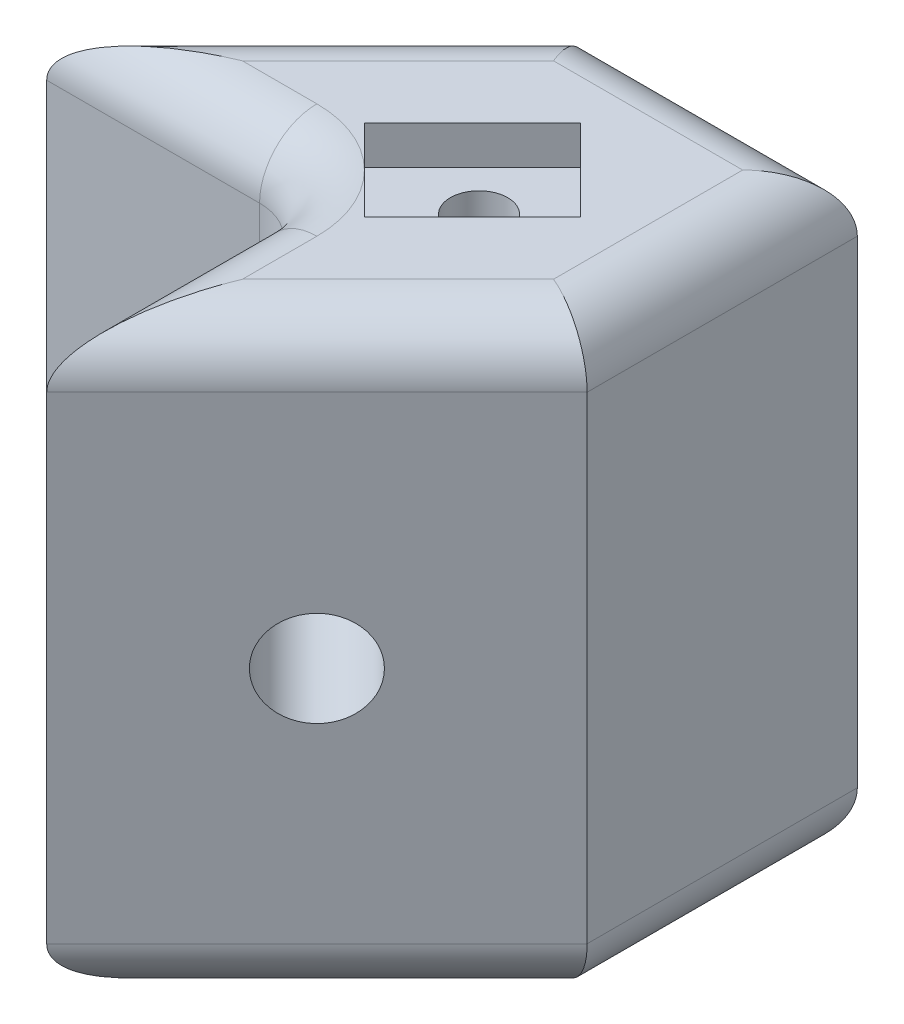
ISO-10303-21;
HEADER;
FILE_DESCRIPTION(('STEP AP214'),'2;1');
FILE_NAME('part.step','',(''),(''),'','','');
FILE_SCHEMA(('AUTOMOTIVE_DESIGN { 1 0 10303 214 1 1 1 1 }'));
ENDSEC;
DATA;
#1=APPLICATION_CONTEXT('core data for automotive mechanical design processes');
#2=APPLICATION_PROTOCOL_DEFINITION('international standard','automotive_design',2000,#1);
#3=PRODUCT_CONTEXT('',#1,'mechanical');
#4=PRODUCT('Part','Part','',(#3));
#5=PRODUCT_RELATED_PRODUCT_CATEGORY('part','',(#4));
#6=PRODUCT_DEFINITION_FORMATION('','',#4);
#7=PRODUCT_DEFINITION_CONTEXT('part definition',#1,'design');
#8=PRODUCT_DEFINITION('design','',#6,#7);
#9=PRODUCT_DEFINITION_SHAPE('','',#8);
#10=(LENGTH_UNIT() NAMED_UNIT(*) SI_UNIT(.MILLI.,.METRE.));
#11=(NAMED_UNIT(*) PLANE_ANGLE_UNIT() SI_UNIT($,.RADIAN.));
#12=(NAMED_UNIT(*) SI_UNIT($,.STERADIAN.) SOLID_ANGLE_UNIT());
#13=UNCERTAINTY_MEASURE_WITH_UNIT(LENGTH_MEASURE(1.E-05),#10,'distance_accuracy_value','');
#14=(GEOMETRIC_REPRESENTATION_CONTEXT(3) GLOBAL_UNCERTAINTY_ASSIGNED_CONTEXT((#13)) GLOBAL_UNIT_ASSIGNED_CONTEXT((#10,
#11,#12)) REPRESENTATION_CONTEXT('',''));
#15=CARTESIAN_POINT('',(0.,0.,0.));
#16=DIRECTION('',(0.,0.,1.));
#17=DIRECTION('',(1.,0.,0.));
#18=AXIS2_PLACEMENT_3D('',#15,#16,#17);
#19=CARTESIAN_POINT('',(0.,0.,0.));
#20=DIRECTION('',(0.,-1.,0.));
#21=DIRECTION('',(0.,0.,-1.));
#22=AXIS2_PLACEMENT_3D('',#19,#20,#21);
#23=PLANE('',#22);
#24=DIRECTION('',(-0.707106781186547,0.,-0.707106781186548));
#25=VECTOR('',#24,1.);
#26=CARTESIAN_POINT('',(-68.4414086658803,0.,95.3821770290879));
#27=LINE('',#26,#25);
#28=CARTESIAN_POINT('',(-68.4414086658803,0.,95.3821770290879));
#29=VERTEX_POINT('',#28);
#30=CARTESIAN_POINT('',(-81.911792847484,0.,81.9117928474841));
#31=VERTEX_POINT('',#30);
#32=EDGE_CURVE('E195',#29,#31,#27,.T.);
#33=ORIENTED_EDGE('',*,*,#32,.T.);
#34=CARTESIAN_POINT('',(-108.852561210692,0.,108.852561210692));
#35=DIRECTION('',(0.,-1.,0.));
#36=DIRECTION('',(0.,0.,-1.));
#37=AXIS2_PLACEMENT_3D('',#34,#35,#36);
#38=CIRCLE('',#37,38.1);
#39=CARTESIAN_POINT('',(-70.7525612106915,0.,108.852561210692));
#40=VERTEX_POINT('',#39);
#41=EDGE_CURVE('E281',#40,#31,#38,.F.);
#42=ORIENTED_EDGE('',*,*,#41,.F.);
#43=DIRECTION('',(0.,0.,1.));
#44=VECTOR('',#43,1.);
#45=CARTESIAN_POINT('',(-70.7525612106915,0.,179.605122524692));
#46=LINE('',#45,#44);
#47=CARTESIAN_POINT('',(-70.7525612106915,0.,133.614354161484));
#48=VERTEX_POINT('',#47);
#49=EDGE_CURVE('E287',#40,#48,#46,.T.);
#50=ORIENTED_EDGE('',*,*,#49,.T.);
#51=DIRECTION('',(-0.707106781186548,0.,0.707106781186548));
#52=VECTOR('',#51,1.);
#53=CARTESIAN_POINT('',(31.4308964753963,0.,31.4308964753963));
#54=LINE('',#53,#52);
#55=CARTESIAN_POINT('',(-19.05,0.,81.9117929507925));
#56=VERTEX_POINT('',#55);
#57=EDGE_CURVE('E289',#48,#56,#54,.F.);
#58=ORIENTED_EDGE('',*,*,#57,.T.);
#59=DIRECTION('',(0.,0.,1.));
#60=VECTOR('',#59,1.);
#61=CARTESIAN_POINT('',(-19.05,0.,0.));
#62=LINE('',#61,#60);
#63=CARTESIAN_POINT('',(-19.05,0.,19.05));
#64=VERTEX_POINT('',#63);
#65=EDGE_CURVE('E291',#56,#64,#62,.F.);
#66=ORIENTED_EDGE('',*,*,#65,.T.);
#67=DIRECTION('',(-1.,0.,0.));
#68=VECTOR('',#67,1.);
#69=CARTESIAN_POINT('',(-89.802561314,0.,19.05));
#70=LINE('',#69,#68);
#71=CARTESIAN_POINT('',(-81.9117929507925,0.,19.05));
#72=VERTEX_POINT('',#71);
#73=EDGE_CURVE('E293',#64,#72,#70,.T.);
#74=ORIENTED_EDGE('',*,*,#73,.T.);
#75=DIRECTION('',(-0.707106781186547,0.,0.707106781186548));
#76=VECTOR('',#75,1.);
#77=CARTESIAN_POINT('',(-166.134738343088,0.,103.272945392295));
#78=LINE('',#77,#76);
#79=CARTESIAN_POINT('',(-133.614354161484,0.,70.7525612106916));
#80=VERTEX_POINT('',#79);
#81=EDGE_CURVE('E295',#72,#80,#78,.T.);
#82=ORIENTED_EDGE('',*,*,#81,.T.);
#83=DIRECTION('',(1.,0.,0.));
#84=VECTOR('',#83,1.);
#85=CARTESIAN_POINT('',(-89.8025612106915,0.,70.7525612106916));
#86=LINE('',#85,#84);
#87=CARTESIAN_POINT('',(-108.852561210692,0.,70.7525612106916));
#88=VERTEX_POINT('',#87);
#89=EDGE_CURVE('E284',#80,#88,#86,.T.);
#90=ORIENTED_EDGE('',*,*,#89,.T.);
#91=EDGE_CURVE('E280',#31,#88,#38,.F.);
#92=ORIENTED_EDGE('',*,*,#91,.F.);
#93=CARTESIAN_POINT('',(-95.3821770290878,0.,68.4414086658804));
#94=VERTEX_POINT('',#93);
#95=EDGE_CURVE('E471',#31,#94,#27,.T.);
#96=ORIENTED_EDGE('',*,*,#95,.T.);
#97=DIRECTION('',(-0.707106781186548,0.,0.707106781186548));
#98=VECTOR('',#97,1.);
#99=CARTESIAN_POINT('',(-59.4611525448112,0.,32.5203841816038));
#100=LINE('',#99,#98);
#101=CARTESIAN_POINT('',(-59.4611525448112,0.,32.5203841816038));
#102=VERTEX_POINT('',#101);
#103=EDGE_CURVE('E470',#102,#94,#100,.T.);
#104=ORIENTED_EDGE('',*,*,#103,.F.);
#105=DIRECTION('',(-0.707106781186548,0.,-0.707106781186547));
#106=VECTOR('',#105,1.);
#107=CARTESIAN_POINT('',(-32.5203841816037,0.,59.4611525448112));
#108=LINE('',#107,#106);
#109=CARTESIAN_POINT('',(-32.5203841816037,0.,59.4611525448112));
#110=VERTEX_POINT('',#109);
#111=EDGE_CURVE('E191',#110,#102,#108,.T.);
#112=ORIENTED_EDGE('',*,*,#111,.F.);
#113=DIRECTION('',(-0.707106781186547,0.,0.707106781186548));
#114=VECTOR('',#113,1.);
#115=CARTESIAN_POINT('',(-32.5203841816037,0.,59.4611525448112));
#116=LINE('',#115,#114);
#117=EDGE_CURVE('E49',#110,#29,#116,.T.);
#118=ORIENTED_EDGE('',*,*,#117,.T.);
#119=EDGE_LOOP('',(#33,#42,#50,#58,#66,#74,#82,#90,#92,#96,#104,#112,#118));
#120=FACE_BOUND('',#119,.T.);
#121=ADVANCED_FACE('F33',(#120),#23,.F.);
#122=CARTESIAN_POINT('',(-108.852561210692,-196.85,108.852561210692));
#123=DIRECTION('',(0.,-1.,0.));
#124=DIRECTION('',(0.,0.,-1.));
#125=AXIS2_PLACEMENT_3D('',#122,#123,#124);
#126=CYLINDRICAL_SURFACE('',#125,19.05);
#127=DIRECTION('',(0.,1.,0.));
#128=VECTOR('',#127,1.);
#129=CARTESIAN_POINT('',(-89.8025612106915,-196.85,108.852561210692));
#130=LINE('',#129,#128);
#131=CARTESIAN_POINT('',(-89.8025612106915,-106.952260529771,108.852561210692));
#132=VERTEX_POINT('',#131);
#133=CARTESIAN_POINT('',(-89.8025612106915,-177.8,108.852561210692));
#134=VERTEX_POINT('',#133);
#135=EDGE_CURVE('E242',#132,#134,#130,.F.);
#136=ORIENTED_EDGE('',*,*,#135,.F.);
#137=CARTESIAN_POINT('',(-89.8025612106915,-106.952260529771,108.852561210692));
#138=CARTESIAN_POINT('',(-89.8025610996064,-107.091775465421,108.729526025421));
#139=CARTESIAN_POINT('',(-89.8037536623177,-107.22856093161,108.603436358006));
#140=CARTESIAN_POINT('',(-89.8088739008022,-107.496518397596,108.34548802045));
#141=CARTESIAN_POINT('',(-89.8128014932628,-107.627690568253,108.213629526152));
#142=CARTESIAN_POINT('',(-89.8292030698284,-108.012369571792,107.810107184494));
#143=CARTESIAN_POINT('',(-89.846294775377,-108.257254987542,107.530305270507));
#144=CARTESIAN_POINT('',(-89.8951696255817,-108.721421500706,106.954464212028));
#145=CARTESIAN_POINT('',(-89.92685818176,-108.940856229056,106.658540264672));
#146=CARTESIAN_POINT('',(-90.0069944433419,-109.3557306283,106.052467823452));
#147=CARTESIAN_POINT('',(-90.0554429804663,-109.551169107718,105.742318624317));
#148=CARTESIAN_POINT('',(-90.1706722920117,-109.91818845735,105.111962736147));
#149=CARTESIAN_POINT('',(-90.2374340989217,-110.089793736707,104.791766755041));
#150=CARTESIAN_POINT('',(-90.3904523707396,-110.410258574604,104.144742652783));
#151=CARTESIAN_POINT('',(-90.4767092036677,-110.559117703661,103.817914406535));
#152=CARTESIAN_POINT('',(-90.6694881334242,-110.835464906661,103.160838787148));
#153=CARTESIAN_POINT('',(-90.7760300304495,-110.962931869126,102.83058837396));
#154=CARTESIAN_POINT('',(-91.0095952709221,-111.197794829894,102.170214835167));
#155=CARTESIAN_POINT('',(-91.1366191787674,-111.305190274934,101.840091713321));
#156=CARTESIAN_POINT('',(-91.41774615504,-111.506232630746,101.166916072162));
#157=CARTESIAN_POINT('',(-91.5728638745224,-111.598959946759,100.82401314344));
#158=CARTESIAN_POINT('',(-91.9051606068343,-111.765819410796,100.144449915766));
#159=CARTESIAN_POINT('',(-92.0823401511815,-111.839951110682,99.807789767441));
#160=CARTESIAN_POINT('',(-92.4581982842507,-111.97123906271,99.1431232847985));
#161=CARTESIAN_POINT('',(-92.6568847626098,-112.028389056269,98.8151201815023));
#162=CARTESIAN_POINT('',(-93.0748873289587,-112.127028880149,98.1700874550337));
#163=CARTESIAN_POINT('',(-93.2942046522671,-112.16851777198,97.8530584905197));
#164=CARTESIAN_POINT('',(-93.7826422308346,-112.241381576293,97.1910555457931));
#165=CARTESIAN_POINT('',(-94.0545195466216,-112.270710307109,96.8478856639461));
#166=CARTESIAN_POINT('',(-94.6218567282006,-112.31166501369,96.1804886498483));
#167=CARTESIAN_POINT('',(-94.9173184580532,-112.323289588697,95.8562630184246));
#168=CARTESIAN_POINT('',(-95.5301729926641,-112.329238948039,95.228725032346));
#169=CARTESIAN_POINT('',(-95.8475776807528,-112.32355428559,94.9254241900891));
#170=CARTESIAN_POINT('',(-96.502126684382,-112.294664995062,94.3418225160919));
#171=CARTESIAN_POINT('',(-96.8392712942535,-112.271460105689,94.0615220274467));
#172=CARTESIAN_POINT('',(-97.5504349156602,-112.204913802739,93.5105294226009));
#173=CARTESIAN_POINT('',(-97.9254614302025,-112.160514225992,93.2412620973615));
#174=CARTESIAN_POINT('',(-98.6918141688159,-112.049649373284,92.7319723184823));
#175=CARTESIAN_POINT('',(-99.0831413983237,-111.983182734446,92.4919516723883));
#176=CARTESIAN_POINT('',(-99.8782884427921,-111.825928877781,92.0426418343549));
#177=CARTESIAN_POINT('',(-100.282105839222,-111.735146342602,91.8333467374265));
#178=CARTESIAN_POINT('',(-101.097875043374,-111.526489792149,91.446497852784));
#179=CARTESIAN_POINT('',(-101.509826049897,-111.408618433206,91.2689409558536));
#180=CARTESIAN_POINT('',(-102.318045077542,-111.148719195231,90.9533363911722));
#181=CARTESIAN_POINT('',(-102.714184213489,-111.008017729368,90.8138699005165));
#182=CARTESIAN_POINT('',(-103.503910152308,-110.696462748399,90.5641526305048));
#183=CARTESIAN_POINT('',(-103.897496807734,-110.525607507259,90.4539035244881));
#184=CARTESIAN_POINT('',(-104.675289772638,-110.151881346529,90.2618901292665));
#185=CARTESIAN_POINT('',(-105.059514239157,-109.949079236432,90.1800658036844));
#186=CARTESIAN_POINT('',(-105.812954655852,-109.509680368496,90.0427295033597));
#187=CARTESIAN_POINT('',(-106.182177825086,-109.273100119154,89.9872047320519));
#188=CARTESIAN_POINT('',(-106.751137912888,-108.870477432954,89.9176288139922));
#189=CARTESIAN_POINT('',(-106.957948362577,-108.715606593162,89.8959181308676));
#190=CARTESIAN_POINT('',(-107.362895319683,-108.394197288004,89.8598082815274));
#191=CARTESIAN_POINT('',(-107.561034467749,-108.227662415396,89.8454068750791));
#192=CARTESIAN_POINT('',(-107.947864851645,-107.882792621584,89.8230673732051));
#193=CARTESIAN_POINT('',(-108.136536153398,-107.70443449951,89.8151424183965));
#194=CARTESIAN_POINT('',(-108.503000577495,-107.336580562159,89.8048841352306));
#195=CARTESIAN_POINT('',(-108.680789328886,-107.147080330816,89.8025530394589));
#196=CARTESIAN_POINT('',(-108.852561210691,-106.952260529771,89.8025612106916));
#197=B_SPLINE_CURVE_WITH_KNOTS('',3,(#137,#138,#139,#140,#141,#142,#143,#144,#145,#146,#147,
#148,#149,#150,#151,#152,#153,#154,#155,#156,#157,#158,#159,#160,#161,#162,#163,#164,#165,#166,
#167,#168,#169,#170,#171,#172,#173,#174,#175,#176,#177,#178,#179,#180,#181,#182,#183,#184,#185,
#186,#187,#188,#189,#190,#191,#192,#193,#194,#195,#196),.UNSPECIFIED.,.F.,.F.,(4,2,2,2,2,2,2,2,
2,2,2,2,2,2,2,2,2,2,2,2,2,2,2,2,2,2,2,2,2,4),(0.,0.557947202142601,1.11587740919651,
2.23087546362454,3.33874776128075,4.44667504543604,5.55345912635883,6.66026410249992,
7.76815501862607,8.87607646878619,10.0377398989257,11.199431321503,12.3615503543313,
13.5237390160175,14.838686776963,16.1537385716191,17.469508204742,18.7852974615709,
20.1750176924842,21.5648237693857,22.9543623957755,24.3437648220382,25.6706169537621,
26.9975450606032,28.3216532564673,29.6451165179323,30.4225149082763,31.1996748883567,
31.9784078258347,32.7574515146123),.UNSPECIFIED.);
#198=CARTESIAN_POINT('',(-108.852561210692,-106.952260529771,89.8025612106916));
#199=VERTEX_POINT('',#198);
#200=EDGE_CURVE('E11',#132,#199,#197,.T.);
#201=ORIENTED_EDGE('',*,*,#200,.T.);
#202=DIRECTION('',(0.,1.,0.));
#203=VECTOR('',#202,1.);
#204=CARTESIAN_POINT('',(-108.852561210692,0.,89.8025612106916));
#205=LINE('',#204,#203);
#206=CARTESIAN_POINT('',(-108.852561210692,-177.8,89.8025612106916));
#207=VERTEX_POINT('',#206);
#208=EDGE_CURVE('E235',#207,#199,#205,.T.);
#209=ORIENTED_EDGE('',*,*,#208,.F.);
#210=CARTESIAN_POINT('',(-108.852561210692,-177.8,108.852561210692));
#211=DIRECTION('',(0.,-1.,0.));
#212=DIRECTION('',(0.,0.,-1.));
#213=AXIS2_PLACEMENT_3D('',#210,#211,#212);
#214=CIRCLE('',#213,19.05);
#215=EDGE_CURVE('E300',#207,#134,#214,.T.);
#216=ORIENTED_EDGE('',*,*,#215,.T.);
#217=EDGE_LOOP('',(#136,#201,#209,#216));
#218=FACE_BOUND('',#217,.T.);
#219=ADVANCED_FACE('F371',(#218),#126,.F.);
#220=CARTESIAN_POINT('',(-179.605122524692,-196.85,89.8025612106916));
#221=DIRECTION('',(0.,0.,1.));
#222=DIRECTION('',(1.,0.,0.));
#223=AXIS2_PLACEMENT_3D('',#220,#221,#222);
#224=PLANE('',#223);
#225=CARTESIAN_POINT('',(-89.8025613139999,-98.552,89.8025612106916));
#226=DIRECTION('',(0.,0.,1.));
#227=DIRECTION('',(1.,0.,0.));
#228=AXIS2_PLACEMENT_3D('',#225,#226,#227);
#229=ELLIPSE('',#228,22.4506403026729,15.875);
#230=CARTESIAN_POINT('',(-108.852561210692,-90.1517394702293,89.8025612106916));
#231=VERTEX_POINT('',#230);
#232=EDGE_CURVE('E210',#231,#199,#229,.T.);
#233=ORIENTED_EDGE('',*,*,#232,.F.);
#234=CARTESIAN_POINT('',(-108.852561210692,-19.05,89.8025612106916));
#235=VERTEX_POINT('',#234);
#236=EDGE_CURVE('E234',#231,#235,#205,.T.);
#237=ORIENTED_EDGE('',*,*,#236,.T.);
#238=DIRECTION('',(1.,0.,0.));
#239=VECTOR('',#238,1.);
#240=CARTESIAN_POINT('',(-179.605122524692,-19.05,89.8025612106916));
#241=LINE('',#240,#239);
#242=CARTESIAN_POINT('',(-179.605122524692,-19.05,89.8025612106916));
#243=VERTEX_POINT('',#242);
#244=EDGE_CURVE('E219',#235,#243,#241,.F.);
#245=ORIENTED_EDGE('',*,*,#244,.T.);
#246=DIRECTION('',(0.,1.,0.));
#247=VECTOR('',#246,1.);
#248=CARTESIAN_POINT('',(-179.605122524692,-196.85,89.8025612106916));
#249=LINE('',#248,#247);
#250=CARTESIAN_POINT('',(-179.605122524692,-177.8,89.8025612106916));
#251=VERTEX_POINT('',#250);
#252=EDGE_CURVE('E216',#251,#243,#249,.T.);
#253=ORIENTED_EDGE('',*,*,#252,.F.);
#254=DIRECTION('',(1.,0.,0.));
#255=VECTOR('',#254,1.);
#256=CARTESIAN_POINT('',(-179.605122524692,-177.8,89.8025612106916));
#257=LINE('',#256,#255);
#258=EDGE_CURVE('E238',#251,#207,#257,.T.);
#259=ORIENTED_EDGE('',*,*,#258,.T.);
#260=ORIENTED_EDGE('',*,*,#208,.T.);
#261=EDGE_LOOP('',(#233,#237,#245,#253,#259,#260));
#262=FACE_BOUND('',#261,.T.);
#263=ADVANCED_FACE('F377',(#262),#224,.T.);
#264=CARTESIAN_POINT('',(-89.802561314,-196.85,0.));
#265=DIRECTION('',(-0.707106781186548,0.,-0.707106781186547));
#266=DIRECTION('',(-0.707106781186547,0.,0.707106781186548));
#267=AXIS2_PLACEMENT_3D('',#264,#265,#266);
#268=PLANE('',#267);
#269=CARTESIAN_POINT('',(-134.703841919346,-98.552,44.9012806053457));
#270=DIRECTION('',(-0.707106781186548,0.,-0.707106781186547));
#271=DIRECTION('',(-0.707106781186547,0.,0.707106781186548));
#272=AXIS2_PLACEMENT_3D('',#269,#270,#271);
#273=CIRCLE('',#272,15.875);
#274=CARTESIAN_POINT('',(-145.929162070682,-98.552,56.1266007566822));
#275=VERTEX_POINT('',#274);
#276=EDGE_CURVE('E212',#275,#275,#273,.T.);
#277=ORIENTED_EDGE('',*,*,#276,.F.);
#278=EDGE_LOOP('',(#277));
#279=FACE_BOUND('',#278,.T.);
#280=DIRECTION('',(0.,1.,0.));
#281=VECTOR('',#280,1.);
#282=CARTESIAN_POINT('',(-89.802561314,-196.85,0.));
#283=LINE('',#282,#281);
#284=CARTESIAN_POINT('',(-89.802561314,-177.8,0.));
#285=VERTEX_POINT('',#284);
#286=CARTESIAN_POINT('',(-89.802561314,-19.05,0.));
#287=VERTEX_POINT('',#286);
#288=EDGE_CURVE('E220',#285,#287,#283,.T.);
#289=ORIENTED_EDGE('',*,*,#288,.F.);
#290=DIRECTION('',(-0.707106781186547,0.,0.707106781186548));
#291=VECTOR('',#290,1.);
#292=CARTESIAN_POINT('',(-89.802561314,-177.8,0.));
#293=LINE('',#292,#291);
#294=EDGE_CURVE('E250',#285,#251,#293,.T.);
#295=ORIENTED_EDGE('',*,*,#294,.T.);
#296=ORIENTED_EDGE('',*,*,#252,.T.);
#297=DIRECTION('',(-0.707106781186547,0.,0.707106781186548));
#298=VECTOR('',#297,1.);
#299=CARTESIAN_POINT('',(-89.802561314,-19.05,0.));
#300=LINE('',#299,#298);
#301=EDGE_CURVE('E248',#243,#287,#300,.F.);
#302=ORIENTED_EDGE('',*,*,#301,.T.);
#303=EDGE_LOOP('',(#289,#295,#296,#302));
#304=FACE_BOUND('',#303,.T.);
#305=ADVANCED_FACE('F373',(#279,#304),#268,.T.);
#306=CARTESIAN_POINT('',(0.,-196.85,0.));
#307=DIRECTION('',(0.,0.,-1.));
#308=DIRECTION('',(-1.,0.,0.));
#309=AXIS2_PLACEMENT_3D('',#306,#307,#308);
#310=PLANE('',#309);
#311=DIRECTION('',(0.,1.,0.));
#312=VECTOR('',#311,1.);
#313=CARTESIAN_POINT('',(0.,-196.85,0.));
#314=LINE('',#313,#312);
#315=CARTESIAN_POINT('',(0.,-177.8,0.));
#316=VERTEX_POINT('',#315);
#317=CARTESIAN_POINT('',(0.,-19.05,0.));
#318=VERTEX_POINT('',#317);
#319=EDGE_CURVE('E223',#316,#318,#314,.T.);
#320=ORIENTED_EDGE('',*,*,#319,.F.);
#321=DIRECTION('',(-1.,0.,0.));
#322=VECTOR('',#321,1.);
#323=CARTESIAN_POINT('',(0.,-177.8,0.));
#324=LINE('',#323,#322);
#325=EDGE_CURVE('E278',#316,#285,#324,.T.);
#326=ORIENTED_EDGE('',*,*,#325,.T.);
#327=ORIENTED_EDGE('',*,*,#288,.T.);
#328=DIRECTION('',(-1.,0.,0.));
#329=VECTOR('',#328,1.);
#330=CARTESIAN_POINT('',(0.,-19.05,0.));
#331=LINE('',#330,#329);
#332=EDGE_CURVE('E276',#287,#318,#331,.F.);
#333=ORIENTED_EDGE('',*,*,#332,.T.);
#334=EDGE_LOOP('',(#320,#326,#327,#333));
#335=FACE_BOUND('',#334,.T.);
#336=ADVANCED_FACE('F376',(#335),#310,.T.);
#337=CARTESIAN_POINT('',(0.,-196.85,0.));
#338=DIRECTION('',(-1.,0.,0.));
#339=DIRECTION('',(0.,0.,1.));
#340=AXIS2_PLACEMENT_3D('',#337,#338,#339);
#341=PLANE('',#340);
#342=DIRECTION('',(0.,1.,0.));
#343=VECTOR('',#342,1.);
#344=CARTESIAN_POINT('',(0.,-196.85,89.802561314));
#345=LINE('',#344,#343);
#346=CARTESIAN_POINT('',(0.,-177.8,89.802561314));
#347=VERTEX_POINT('',#346);
#348=CARTESIAN_POINT('',(0.,-19.05,89.802561314));
#349=VERTEX_POINT('',#348);
#350=EDGE_CURVE('E226',#347,#349,#345,.T.);
#351=ORIENTED_EDGE('',*,*,#350,.F.);
#352=DIRECTION('',(0.,0.,1.));
#353=VECTOR('',#352,1.);
#354=CARTESIAN_POINT('',(0.,-177.8,0.));
#355=LINE('',#354,#353);
#356=EDGE_CURVE('E274',#347,#316,#355,.F.);
#357=ORIENTED_EDGE('',*,*,#356,.T.);
#358=ORIENTED_EDGE('',*,*,#319,.T.);
#359=DIRECTION('',(0.,0.,1.));
#360=VECTOR('',#359,1.);
#361=CARTESIAN_POINT('',(0.,-19.05,0.));
#362=LINE('',#361,#360);
#363=EDGE_CURVE('E272',#318,#349,#362,.T.);
#364=ORIENTED_EDGE('',*,*,#363,.T.);
#365=EDGE_LOOP('',(#351,#357,#358,#364));
#366=FACE_BOUND('',#365,.T.);
#367=ADVANCED_FACE('F381',(#366),#341,.F.);
#368=CARTESIAN_POINT('',(0.,-196.85,89.802561314));
#369=DIRECTION('',(-0.707106781186548,0.,-0.707106781186548));
#370=DIRECTION('',(-0.707106781186548,0.,0.707106781186548));
#371=AXIS2_PLACEMENT_3D('',#368,#369,#370);
#372=PLANE('',#371);
#373=CARTESIAN_POINT('',(-44.9012806053457,-98.552,134.703841919346));
#374=DIRECTION('',(0.707106781186548,0.,0.707106781186547));
#375=DIRECTION('',(0.707106781186547,0.,-0.707106781186548));
#376=AXIS2_PLACEMENT_3D('',#373,#374,#375);
#377=CIRCLE('',#376,15.875);
#378=CARTESIAN_POINT('',(-33.6759604540092,-98.552,123.478521768009));
#379=VERTEX_POINT('',#378);
#380=EDGE_CURVE('E206',#379,#379,#377,.T.);
#381=ORIENTED_EDGE('',*,*,#380,.F.);
#382=EDGE_LOOP('',(#381));
#383=FACE_BOUND('',#382,.T.);
#384=DIRECTION('',(0.,1.,0.));
#385=VECTOR('',#384,1.);
#386=CARTESIAN_POINT('',(-89.8025612106915,-196.85,179.605122524692));
#387=LINE('',#386,#385);
#388=CARTESIAN_POINT('',(-89.8025612106915,-177.8,179.605122524692));
#389=VERTEX_POINT('',#388);
#390=CARTESIAN_POINT('',(-89.8025612106915,-19.05,179.605122524692));
#391=VERTEX_POINT('',#390);
#392=EDGE_CURVE('E229',#389,#391,#387,.T.);
#393=ORIENTED_EDGE('',*,*,#392,.F.);
#394=DIRECTION('',(-0.707106781186548,0.,0.707106781186548));
#395=VECTOR('',#394,1.);
#396=CARTESIAN_POINT('',(0.,-177.8,89.802561314));
#397=LINE('',#396,#395);
#398=EDGE_CURVE('E270',#389,#347,#397,.F.);
#399=ORIENTED_EDGE('',*,*,#398,.T.);
#400=ORIENTED_EDGE('',*,*,#350,.T.);
#401=DIRECTION('',(-0.707106781186548,0.,0.707106781186548));
#402=VECTOR('',#401,1.);
#403=CARTESIAN_POINT('',(0.,-19.05,89.802561314));
#404=LINE('',#403,#402);
#405=EDGE_CURVE('E268',#349,#391,#404,.T.);
#406=ORIENTED_EDGE('',*,*,#405,.T.);
#407=EDGE_LOOP('',(#393,#399,#400,#406));
#408=FACE_BOUND('',#407,.T.);
#409=ADVANCED_FACE('F385',(#383,#408),#372,.F.);
#410=CARTESIAN_POINT('',(-89.8025612106915,-196.85,89.8025612106916));
#411=DIRECTION('',(-1.,0.,0.));
#412=DIRECTION('',(0.,0.,1.));
#413=AXIS2_PLACEMENT_3D('',#410,#411,#412);
#414=PLANE('',#413);
#415=CARTESIAN_POINT('',(-89.8025612106915,-98.552,89.8025613139999));
#416=DIRECTION('',(-1.,0.,0.));
#417=DIRECTION('',(0.,0.,1.));
#418=AXIS2_PLACEMENT_3D('',#415,#416,#417);
#419=ELLIPSE('',#418,22.4506403026729,15.875);
#420=CARTESIAN_POINT('',(-89.8025612106915,-90.1517394702293,108.852561210692));
#421=VERTEX_POINT('',#420);
#422=EDGE_CURVE('E57',#132,#421,#419,.T.);
#423=ORIENTED_EDGE('',*,*,#422,.F.);
#424=ORIENTED_EDGE('',*,*,#135,.T.);
#425=DIRECTION('',(0.,0.,1.));
#426=VECTOR('',#425,1.);
#427=CARTESIAN_POINT('',(-89.8025612106915,-177.8,89.8025612106916));
#428=LINE('',#427,#426);
#429=EDGE_CURVE('E246',#134,#389,#428,.T.);
#430=ORIENTED_EDGE('',*,*,#429,.T.);
#431=ORIENTED_EDGE('',*,*,#392,.T.);
#432=DIRECTION('',(0.,0.,1.));
#433=VECTOR('',#432,1.);
#434=CARTESIAN_POINT('',(-89.8025612106915,-19.05,89.8025612106916));
#435=LINE('',#434,#433);
#436=CARTESIAN_POINT('',(-89.8025612106915,-19.05,108.852561210692));
#437=VERTEX_POINT('',#436);
#438=EDGE_CURVE('E240',#391,#437,#435,.F.);
#439=ORIENTED_EDGE('',*,*,#438,.T.);
#440=EDGE_CURVE('E243',#437,#421,#130,.F.);
#441=ORIENTED_EDGE('',*,*,#440,.T.);
#442=EDGE_LOOP('',(#423,#424,#430,#431,#439,#441));
#443=FACE_BOUND('',#442,.T.);
#444=ADVANCED_FACE('F367',(#443),#414,.T.);
#445=CARTESIAN_POINT('',(0.,-196.85,0.));
#446=DIRECTION('',(0.,-1.,0.));
#447=DIRECTION('',(0.,0.,-1.));
#448=AXIS2_PLACEMENT_3D('',#445,#446,#447);
#449=PLANE('',#448);
#450=CARTESIAN_POINT('',(-62.8617928474841,-196.85,62.8617928474841));
#451=DIRECTION('',(0.,1.,0.));
#452=DIRECTION('',(0.,0.,1.));
#453=AXIS2_PLACEMENT_3D('',#450,#451,#452);
#454=CIRCLE('',#453,9.525);
#455=CARTESIAN_POINT('',(-62.8617928474841,-196.85,72.3867928474841));
#456=VERTEX_POINT('',#455);
#457=EDGE_CURVE('E199',#456,#456,#454,.T.);
#458=ORIENTED_EDGE('',*,*,#457,.T.);
#459=EDGE_LOOP('',(#458));
#460=FACE_BOUND('',#459,.T.);
#461=CARTESIAN_POINT('',(-108.852561210692,-196.85,108.852561210692));
#462=DIRECTION('',(0.,-1.,0.));
#463=DIRECTION('',(0.,0.,-1.));
#464=AXIS2_PLACEMENT_3D('',#461,#462,#463);
#465=CIRCLE('',#464,38.1);
#466=CARTESIAN_POINT('',(-108.852561210692,-196.85,70.7525612106916));
#467=VERTEX_POINT('',#466);
#468=CARTESIAN_POINT('',(-70.7525612106915,-196.85,108.852561210692));
#469=VERTEX_POINT('',#468);
#470=EDGE_CURVE('E263',#467,#469,#465,.T.);
#471=ORIENTED_EDGE('',*,*,#470,.F.);
#472=DIRECTION('',(1.,0.,0.));
#473=VECTOR('',#472,1.);
#474=CARTESIAN_POINT('',(0.,-196.85,70.7525612106916));
#475=LINE('',#474,#473);
#476=CARTESIAN_POINT('',(-133.614354161484,-196.85,70.7525612106916));
#477=VERTEX_POINT('',#476);
#478=EDGE_CURVE('E266',#467,#477,#475,.F.);
#479=ORIENTED_EDGE('',*,*,#478,.T.);
#480=DIRECTION('',(-0.707106781186547,0.,0.707106781186548));
#481=VECTOR('',#480,1.);
#482=CARTESIAN_POINT('',(-31.4308964753963,-196.85,-31.4308964753963));
#483=LINE('',#482,#481);
#484=CARTESIAN_POINT('',(-81.9117929507925,-196.85,19.05));
#485=VERTEX_POINT('',#484);
#486=EDGE_CURVE('E260',#477,#485,#483,.F.);
#487=ORIENTED_EDGE('',*,*,#486,.T.);
#488=DIRECTION('',(-1.,0.,0.));
#489=VECTOR('',#488,1.);
#490=CARTESIAN_POINT('',(0.,-196.85,19.05));
#491=LINE('',#490,#489);
#492=CARTESIAN_POINT('',(-19.05,-196.85,19.05));
#493=VERTEX_POINT('',#492);
#494=EDGE_CURVE('E252',#485,#493,#491,.F.);
#495=ORIENTED_EDGE('',*,*,#494,.T.);
#496=DIRECTION('',(0.,0.,1.));
#497=VECTOR('',#496,1.);
#498=CARTESIAN_POINT('',(-19.05,-196.85,89.802561314));
#499=LINE('',#498,#497);
#500=CARTESIAN_POINT('',(-19.05,-196.85,81.9117929507925));
#501=VERTEX_POINT('',#500);
#502=EDGE_CURVE('E254',#493,#501,#499,.T.);
#503=ORIENTED_EDGE('',*,*,#502,.T.);
#504=DIRECTION('',(-0.707106781186548,0.,0.707106781186548));
#505=VECTOR('',#504,1.);
#506=CARTESIAN_POINT('',(-103.272945392295,-196.85,166.134738343088));
#507=LINE('',#506,#505);
#508=CARTESIAN_POINT('',(-70.7525612106915,-196.85,133.614354161484));
#509=VERTEX_POINT('',#508);
#510=EDGE_CURVE('E256',#501,#509,#507,.T.);
#511=ORIENTED_EDGE('',*,*,#510,.T.);
#512=DIRECTION('',(0.,0.,1.));
#513=VECTOR('',#512,1.);
#514=CARTESIAN_POINT('',(-70.7525612106915,-196.85,0.));
#515=LINE('',#514,#513);
#516=EDGE_CURVE('E258',#509,#469,#515,.F.);
#517=ORIENTED_EDGE('',*,*,#516,.T.);
#518=EDGE_LOOP('',(#471,#479,#487,#495,#503,#511,#517));
#519=FACE_BOUND('',#518,.T.);
#520=ADVANCED_FACE('F363',(#460,#519),#449,.T.);
#521=CARTESIAN_POINT('',(-19.05,-177.8,0.));
#522=DIRECTION('',(0.,0.,-1.));
#523=DIRECTION('',(-1.,0.,0.));
#524=AXIS2_PLACEMENT_3D('',#521,#522,#523);
#525=CYLINDRICAL_SURFACE('',#524,19.05);
#526=CARTESIAN_POINT('',(-19.05,-177.8,81.9117929507925));
#527=DIRECTION('',(0.38268343236509,0.,-0.923879532511287));
#528=DIRECTION('',(-0.923879532511287,0.,-0.38268343236509));
#529=AXIS2_PLACEMENT_3D('',#526,#527,#528);
#530=ELLIPSE('',#529,20.6195714155701,19.05);
#531=EDGE_CURVE('E335',#501,#347,#530,.F.);
#532=ORIENTED_EDGE('',*,*,#531,.F.);
#533=ORIENTED_EDGE('',*,*,#502,.F.);
#534=CARTESIAN_POINT('',(-19.05,-177.8,19.05));
#535=DIRECTION('',(-0.707106781186548,0.,-0.707106781186547));
#536=DIRECTION('',(-0.707106781186547,0.,0.707106781186548));
#537=AXIS2_PLACEMENT_3D('',#534,#535,#536);
#538=ELLIPSE('',#537,26.9407683632075,19.05);
#539=EDGE_CURVE('E232',#316,#493,#538,.T.);
#540=ORIENTED_EDGE('',*,*,#539,.F.);
#541=ORIENTED_EDGE('',*,*,#356,.F.);
#542=EDGE_LOOP('',(#532,#533,#540,#541));
#543=FACE_BOUND('',#542,.T.);
#544=ADVANCED_FACE('F35',(#543),#525,.T.);
#545=CARTESIAN_POINT('',(0.,-177.8,19.05));
#546=DIRECTION('',(-1.,0.,0.));
#547=DIRECTION('',(0.,0.,1.));
#548=AXIS2_PLACEMENT_3D('',#545,#546,#547);
#549=CYLINDRICAL_SURFACE('',#548,19.05);
#550=ORIENTED_EDGE('',*,*,#539,.T.);
#551=ORIENTED_EDGE('',*,*,#494,.F.);
#552=CARTESIAN_POINT('',(-81.9117929507925,-177.8,19.05));
#553=DIRECTION('',(-0.923879532511287,0.,0.38268343236509));
#554=DIRECTION('',(-0.38268343236509,0.,-0.923879532511287));
#555=AXIS2_PLACEMENT_3D('',#552,#553,#554);
#556=ELLIPSE('',#555,20.6195714155701,19.05);
#557=EDGE_CURVE('E333',#285,#485,#556,.T.);
#558=ORIENTED_EDGE('',*,*,#557,.F.);
#559=ORIENTED_EDGE('',*,*,#325,.F.);
#560=EDGE_LOOP('',(#550,#551,#558,#559));
#561=FACE_BOUND('',#560,.T.);
#562=ADVANCED_FACE('F446',(#561),#549,.T.);
#563=CARTESIAN_POINT('',(0.,-19.05,19.05));
#564=DIRECTION('',(1.,0.,0.));
#565=DIRECTION('',(0.,0.,-1.));
#566=AXIS2_PLACEMENT_3D('',#563,#564,#565);
#567=CYLINDRICAL_SURFACE('',#566,19.05);
#568=CARTESIAN_POINT('',(-81.9117929507925,-19.05,19.05));
#569=DIRECTION('',(0.923879532511287,0.,-0.38268343236509));
#570=DIRECTION('',(0.38268343236509,0.,0.923879532511287));
#571=AXIS2_PLACEMENT_3D('',#568,#569,#570);
#572=ELLIPSE('',#571,20.6195714155701,19.05);
#573=EDGE_CURVE('E330',#72,#287,#572,.F.);
#574=ORIENTED_EDGE('',*,*,#573,.F.);
#575=ORIENTED_EDGE('',*,*,#73,.F.);
#576=CARTESIAN_POINT('',(-19.05,-19.05,19.05));
#577=DIRECTION('',(0.707106781186548,0.,0.707106781186547));
#578=DIRECTION('',(-0.707106781186547,0.,0.707106781186548));
#579=AXIS2_PLACEMENT_3D('',#576,#577,#578);
#580=ELLIPSE('',#579,26.9407683632075,19.05);
#581=EDGE_CURVE('E338',#318,#64,#580,.T.);
#582=ORIENTED_EDGE('',*,*,#581,.F.);
#583=ORIENTED_EDGE('',*,*,#332,.F.);
#584=EDGE_LOOP('',(#574,#575,#582,#583));
#585=FACE_BOUND('',#584,.T.);
#586=ADVANCED_FACE('F425',(#585),#567,.T.);
#587=CARTESIAN_POINT('',(-19.05,-19.05,0.));
#588=DIRECTION('',(0.,0.,1.));
#589=DIRECTION('',(1.,0.,0.));
#590=AXIS2_PLACEMENT_3D('',#587,#588,#589);
#591=CYLINDRICAL_SURFACE('',#590,19.05);
#592=ORIENTED_EDGE('',*,*,#581,.T.);
#593=ORIENTED_EDGE('',*,*,#65,.F.);
#594=CARTESIAN_POINT('',(-19.05,-19.05,81.9117929507925));
#595=DIRECTION('',(-0.38268343236509,0.,0.923879532511287));
#596=DIRECTION('',(-0.923879532511287,0.,-0.38268343236509));
#597=AXIS2_PLACEMENT_3D('',#594,#595,#596);
#598=ELLIPSE('',#597,20.6195714155701,19.05);
#599=EDGE_CURVE('E327',#349,#56,#598,.T.);
#600=ORIENTED_EDGE('',*,*,#599,.F.);
#601=ORIENTED_EDGE('',*,*,#363,.F.);
#602=EDGE_LOOP('',(#592,#593,#600,#601));
#603=FACE_BOUND('',#602,.T.);
#604=ADVANCED_FACE('F478',(#603),#591,.T.);
#605=CARTESIAN_POINT('',(31.4308964753963,-177.8,31.4308964753963));
#606=DIRECTION('',(0.707106781186548,0.,-0.707106781186548));
#607=DIRECTION('',(-0.707106781186548,0.,-0.707106781186548));
#608=AXIS2_PLACEMENT_3D('',#605,#606,#607);
#609=CYLINDRICAL_SURFACE('',#608,19.05);
#610=ORIENTED_EDGE('',*,*,#531,.T.);
#611=ORIENTED_EDGE('',*,*,#398,.F.);
#612=CARTESIAN_POINT('',(-70.7525612106915,-177.8,133.614354161484));
#613=DIRECTION('',(0.923879532511287,0.,0.38268343236509));
#614=DIRECTION('',(0.38268343236509,0.,-0.923879532511287));
#615=AXIS2_PLACEMENT_3D('',#612,#613,#614);
#616=ELLIPSE('',#615,49.78004896179,19.05);
#617=EDGE_CURVE('E324',#509,#389,#616,.F.);
#618=ORIENTED_EDGE('',*,*,#617,.F.);
#619=ORIENTED_EDGE('',*,*,#510,.F.);
#620=EDGE_LOOP('',(#610,#611,#618,#619));
#621=FACE_BOUND('',#620,.T.);
#622=ADVANCED_FACE('F439',(#621),#609,.T.);
#623=CARTESIAN_POINT('',(-76.3321771323963,-177.8,13.4703841816037));
#624=DIRECTION('',(-0.707106781186547,0.,0.707106781186548));
#625=DIRECTION('',(0.707106781186548,0.,0.707106781186547));
#626=AXIS2_PLACEMENT_3D('',#623,#624,#625);
#627=CYLINDRICAL_SURFACE('',#626,19.05);
#628=ORIENTED_EDGE('',*,*,#557,.T.);
#629=ORIENTED_EDGE('',*,*,#486,.F.);
#630=CARTESIAN_POINT('',(-133.614354161484,-177.8,70.7525612106916));
#631=DIRECTION('',(0.38268343236509,0.,0.923879532511287));
#632=DIRECTION('',(0.923879532511287,0.,-0.38268343236509));
#633=AXIS2_PLACEMENT_3D('',#630,#631,#632);
#634=ELLIPSE('',#633,49.7800489617899,19.05);
#635=EDGE_CURVE('E321',#251,#477,#634,.T.);
#636=ORIENTED_EDGE('',*,*,#635,.F.);
#637=ORIENTED_EDGE('',*,*,#294,.F.);
#638=EDGE_LOOP('',(#628,#629,#636,#637));
#639=FACE_BOUND('',#638,.T.);
#640=ADVANCED_FACE('F450',(#639),#627,.T.);
#641=CARTESIAN_POINT('',(-31.4308964753963,-19.05,-31.4308964753963));
#642=DIRECTION('',(0.707106781186547,0.,-0.707106781186548));
#643=DIRECTION('',(-0.707106781186548,0.,-0.707106781186547));
#644=AXIS2_PLACEMENT_3D('',#641,#642,#643);
#645=CYLINDRICAL_SURFACE('',#644,19.05);
#646=ORIENTED_EDGE('',*,*,#573,.T.);
#647=ORIENTED_EDGE('',*,*,#301,.F.);
#648=CARTESIAN_POINT('',(-133.614354161484,-19.05,70.7525612106916));
#649=DIRECTION('',(-0.38268343236509,0.,-0.923879532511287));
#650=DIRECTION('',(-0.923879532511287,0.,0.38268343236509));
#651=AXIS2_PLACEMENT_3D('',#648,#649,#650);
#652=ELLIPSE('',#651,49.7800489617899,19.05);
#653=EDGE_CURVE('E318',#80,#243,#652,.F.);
#654=ORIENTED_EDGE('',*,*,#653,.F.);
#655=ORIENTED_EDGE('',*,*,#81,.F.);
#656=EDGE_LOOP('',(#646,#647,#654,#655));
#657=FACE_BOUND('',#656,.T.);
#658=ADVANCED_FACE('F419',(#657),#645,.T.);
#659=CARTESIAN_POINT('',(-13.4703841816037,-19.05,76.3321771323963));
#660=DIRECTION('',(-0.707106781186548,0.,0.707106781186548));
#661=DIRECTION('',(0.707106781186548,0.,0.707106781186548));
#662=AXIS2_PLACEMENT_3D('',#659,#660,#661);
#663=CYLINDRICAL_SURFACE('',#662,19.05);
#664=ORIENTED_EDGE('',*,*,#599,.T.);
#665=ORIENTED_EDGE('',*,*,#57,.F.);
#666=CARTESIAN_POINT('',(-70.7525612106915,-19.05,133.614354161484));
#667=DIRECTION('',(-0.923879532511287,0.,-0.38268343236509));
#668=DIRECTION('',(0.38268343236509,0.,-0.923879532511287));
#669=AXIS2_PLACEMENT_3D('',#666,#667,#668);
#670=ELLIPSE('',#669,49.78004896179,19.05);
#671=EDGE_CURVE('E315',#391,#48,#670,.T.);
#672=ORIENTED_EDGE('',*,*,#671,.F.);
#673=ORIENTED_EDGE('',*,*,#405,.F.);
#674=EDGE_LOOP('',(#664,#665,#672,#673));
#675=FACE_BOUND('',#674,.T.);
#676=ADVANCED_FACE('F481',(#675),#663,.T.);
#677=CARTESIAN_POINT('',(-70.7525612106915,-177.8,89.8025612106916));
#678=DIRECTION('',(0.,0.,1.));
#679=DIRECTION('',(1.,0.,0.));
#680=AXIS2_PLACEMENT_3D('',#677,#678,#679);
#681=CYLINDRICAL_SURFACE('',#680,19.05);
#682=ORIENTED_EDGE('',*,*,#617,.T.);
#683=ORIENTED_EDGE('',*,*,#429,.F.);
#684=CARTESIAN_POINT('',(-70.7525612106915,-177.8,108.852561210692));
#685=DIRECTION('',(0.,0.,-1.));
#686=DIRECTION('',(-1.,0.,0.));
#687=AXIS2_PLACEMENT_3D('',#684,#685,#686);
#688=CIRCLE('',#687,19.05);
#689=EDGE_CURVE('E312',#469,#134,#688,.T.);
#690=ORIENTED_EDGE('',*,*,#689,.F.);
#691=ORIENTED_EDGE('',*,*,#516,.F.);
#692=EDGE_LOOP('',(#682,#683,#690,#691));
#693=FACE_BOUND('',#692,.T.);
#694=ADVANCED_FACE('F484',(#693),#681,.T.);
#695=CARTESIAN_POINT('',(-179.605122524692,-177.8,70.7525612106916));
#696=DIRECTION('',(1.,0.,0.));
#697=DIRECTION('',(0.,0.,-1.));
#698=AXIS2_PLACEMENT_3D('',#695,#696,#697);
#699=CYLINDRICAL_SURFACE('',#698,19.05);
#700=ORIENTED_EDGE('',*,*,#635,.T.);
#701=ORIENTED_EDGE('',*,*,#478,.F.);
#702=CARTESIAN_POINT('',(-108.852561210692,-177.8,70.7525612106916));
#703=DIRECTION('',(1.,0.,0.));
#704=DIRECTION('',(0.,0.,-1.));
#705=AXIS2_PLACEMENT_3D('',#702,#703,#704);
#706=CIRCLE('',#705,19.05);
#707=EDGE_CURVE('E309',#207,#467,#706,.T.);
#708=ORIENTED_EDGE('',*,*,#707,.F.);
#709=ORIENTED_EDGE('',*,*,#258,.F.);
#710=EDGE_LOOP('',(#700,#701,#708,#709));
#711=FACE_BOUND('',#710,.T.);
#712=ADVANCED_FACE('F455',(#711),#699,.T.);
#713=CARTESIAN_POINT('',(0.,-19.05,70.7525612106916));
#714=DIRECTION('',(-1.,0.,0.));
#715=DIRECTION('',(0.,0.,1.));
#716=AXIS2_PLACEMENT_3D('',#713,#714,#715);
#717=CYLINDRICAL_SURFACE('',#716,19.05);
#718=ORIENTED_EDGE('',*,*,#653,.T.);
#719=ORIENTED_EDGE('',*,*,#244,.F.);
#720=CARTESIAN_POINT('',(-108.852561210692,-19.05,70.7525612106916));
#721=DIRECTION('',(1.,0.,0.));
#722=DIRECTION('',(0.,0.,-1.));
#723=AXIS2_PLACEMENT_3D('',#720,#721,#722);
#724=CIRCLE('',#723,19.05);
#725=EDGE_CURVE('E306',#88,#235,#724,.T.);
#726=ORIENTED_EDGE('',*,*,#725,.F.);
#727=ORIENTED_EDGE('',*,*,#89,.F.);
#728=EDGE_LOOP('',(#718,#719,#726,#727));
#729=FACE_BOUND('',#728,.T.);
#730=ADVANCED_FACE('F410',(#729),#717,.T.);
#731=CARTESIAN_POINT('',(-70.7525612106915,-19.05,0.));
#732=DIRECTION('',(0.,0.,-1.));
#733=DIRECTION('',(-1.,0.,0.));
#734=AXIS2_PLACEMENT_3D('',#731,#732,#733);
#735=CYLINDRICAL_SURFACE('',#734,19.05);
#736=ORIENTED_EDGE('',*,*,#671,.T.);
#737=ORIENTED_EDGE('',*,*,#49,.F.);
#738=CARTESIAN_POINT('',(-70.7525612106915,-19.05,108.852561210692));
#739=DIRECTION('',(0.,0.,-1.));
#740=DIRECTION('',(-1.,0.,0.));
#741=AXIS2_PLACEMENT_3D('',#738,#739,#740);
#742=CIRCLE('',#741,19.05);
#743=EDGE_CURVE('E303',#437,#40,#742,.T.);
#744=ORIENTED_EDGE('',*,*,#743,.F.);
#745=ORIENTED_EDGE('',*,*,#438,.F.);
#746=EDGE_LOOP('',(#736,#737,#744,#745));
#747=FACE_BOUND('',#746,.T.);
#748=ADVANCED_FACE('F467',(#747),#735,.T.);
#749=CARTESIAN_POINT('',(-108.852561210692,-177.8,108.852561210692));
#750=DIRECTION('',(0.,-1.,0.));
#751=DIRECTION('',(0.,0.,-1.));
#752=AXIS2_PLACEMENT_3D('',#749,#750,#751);
#753=TOROIDAL_SURFACE('',#752,38.1,19.05);
#754=ORIENTED_EDGE('',*,*,#470,.T.);
#755=ORIENTED_EDGE('',*,*,#689,.T.);
#756=ORIENTED_EDGE('',*,*,#215,.F.);
#757=ORIENTED_EDGE('',*,*,#707,.T.);
#758=EDGE_LOOP('',(#754,#755,#756,#757));
#759=FACE_BOUND('',#758,.T.);
#760=ADVANCED_FACE('F458',(#759),#753,.T.);
#761=CARTESIAN_POINT('',(-108.852561210692,-19.05,108.852561210692));
#762=DIRECTION('',(0.,-1.,0.));
#763=DIRECTION('',(0.,0.,-1.));
#764=AXIS2_PLACEMENT_3D('',#761,#762,#763);
#765=TOROIDAL_SURFACE('',#764,38.1,19.05);
#766=ORIENTED_EDGE('',*,*,#41,.T.);
#767=ORIENTED_EDGE('',*,*,#91,.T.);
#768=ORIENTED_EDGE('',*,*,#725,.T.);
#769=CARTESIAN_POINT('',(-108.852561210692,-19.05,108.852561210692));
#770=DIRECTION('',(0.,-1.,0.));
#771=DIRECTION('',(0.,0.,-1.));
#772=AXIS2_PLACEMENT_3D('',#769,#770,#771);
#773=CIRCLE('',#772,19.05);
#774=EDGE_CURVE('E215',#437,#235,#773,.F.);
#775=ORIENTED_EDGE('',*,*,#774,.F.);
#776=ORIENTED_EDGE('',*,*,#743,.T.);
#777=EDGE_LOOP('',(#766,#767,#768,#775,#776));
#778=FACE_BOUND('',#777,.T.);
#779=ADVANCED_FACE('F407',(#778),#765,.T.);
#780=ORIENTED_EDGE('',*,*,#236,.F.);
#781=CARTESIAN_POINT('',(-108.852561210692,-90.1517394702293,89.8025612106916));
#782=CARTESIAN_POINT('',(-108.729526025421,-90.0122245345788,89.8025610996065));
#783=CARTESIAN_POINT('',(-108.603436358006,-89.8754390683898,89.8037536623177));
#784=CARTESIAN_POINT('',(-108.34548802045,-89.6074816024036,89.8088739008023));
#785=CARTESIAN_POINT('',(-108.213629526152,-89.4763094317469,89.8128014932628));
#786=CARTESIAN_POINT('',(-107.810107184494,-89.0916304282079,89.8292030698285));
#787=CARTESIAN_POINT('',(-107.530305270507,-88.8467450124583,89.846294775377));
#788=CARTESIAN_POINT('',(-106.954464212028,-88.3825784992945,89.8951696255818));
#789=CARTESIAN_POINT('',(-106.658540264672,-88.1631437709438,89.9268581817601));
#790=CARTESIAN_POINT('',(-106.052467823452,-87.7482693716996,90.0069944433419));
#791=CARTESIAN_POINT('',(-105.742318624317,-87.5528308922819,90.0554429804663));
#792=CARTESIAN_POINT('',(-105.111962736147,-87.1858115426505,90.1706722920117));
#793=CARTESIAN_POINT('',(-104.791766755041,-87.0142062632932,90.2374340989217));
#794=CARTESIAN_POINT('',(-104.144742652783,-86.693741425396,90.3904523707397));
#795=CARTESIAN_POINT('',(-103.817914406535,-86.5448822963388,90.4767092036677));
#796=CARTESIAN_POINT('',(-103.160838787148,-86.2685350933393,90.6694881334242));
#797=CARTESIAN_POINT('',(-102.83058837396,-86.1410681308742,90.7760300304495));
#798=CARTESIAN_POINT('',(-102.170214835167,-85.9062051701063,91.0095952709221));
#799=CARTESIAN_POINT('',(-101.840091713321,-85.7988097250664,91.1366191787675));
#800=CARTESIAN_POINT('',(-101.166916072162,-85.5977673692535,91.4177461550401));
#801=CARTESIAN_POINT('',(-100.82401314344,-85.5050400532406,91.5728638745224));
#802=CARTESIAN_POINT('',(-100.144449915766,-85.3381805892036,91.9051606068343));
#803=CARTESIAN_POINT('',(-99.8077897674409,-85.2640488893185,92.0823401511815));
#804=CARTESIAN_POINT('',(-99.1431232847985,-85.1327609372899,92.4581982842508));
#805=CARTESIAN_POINT('',(-98.8151201815022,-85.0756109437309,92.6568847626098));
#806=CARTESIAN_POINT('',(-98.1700874550337,-84.9769711198506,93.0748873289587));
#807=CARTESIAN_POINT('',(-97.8530584905196,-84.9354822280199,93.2942046522672));
#808=CARTESIAN_POINT('',(-97.191055545793,-84.8626184237066,93.7826422308347));
#809=CARTESIAN_POINT('',(-96.847885663946,-84.8332896928913,94.0545195466217));
#810=CARTESIAN_POINT('',(-96.1804886498483,-84.79233498631,94.6218567282007));
#811=CARTESIAN_POINT('',(-95.8562630184246,-84.7807104113028,94.9173184580533));
#812=CARTESIAN_POINT('',(-95.228725032346,-84.774761051961,95.5301729926641));
#813=CARTESIAN_POINT('',(-94.9254241900891,-84.7804457144103,95.8475776807528));
#814=CARTESIAN_POINT('',(-94.3418225160919,-84.8093350049376,96.502126684382));
#815=CARTESIAN_POINT('',(-94.0615220274467,-84.8325398943114,96.8392712942535));
#816=CARTESIAN_POINT('',(-93.5105294226009,-84.899086197261,97.5504349156602));
#817=CARTESIAN_POINT('',(-93.2412620973614,-84.9434857740077,97.9254614302025));
#818=CARTESIAN_POINT('',(-92.7319723184823,-85.0543506267164,98.6918141688159));
#819=CARTESIAN_POINT('',(-92.4919516723882,-85.1208172655543,99.0831413983237));
#820=CARTESIAN_POINT('',(-92.0426418343549,-85.2780711222189,99.8782884427922));
#821=CARTESIAN_POINT('',(-91.8333467374264,-85.3688536573979,100.282105839222));
#822=CARTESIAN_POINT('',(-91.4464978527839,-85.5775102078511,101.097875043374));
#823=CARTESIAN_POINT('',(-91.2689409558536,-85.695381566794,101.509826049897));
#824=CARTESIAN_POINT('',(-90.9533363911721,-85.9552808047693,102.318045077542));
#825=CARTESIAN_POINT('',(-90.8138699005165,-86.0959822706322,102.714184213489));
#826=CARTESIAN_POINT('',(-90.5641526305048,-86.4075372516006,103.503910152308));
#827=CARTESIAN_POINT('',(-90.453903524488,-86.5783924927412,103.897496807735));
#828=CARTESIAN_POINT('',(-90.2618901292665,-86.9521186534712,104.675289772638));
#829=CARTESIAN_POINT('',(-90.1800658036844,-87.1549207635683,105.059514239157));
#830=CARTESIAN_POINT('',(-90.0427295033597,-87.5943196315045,105.812954655852));
#831=CARTESIAN_POINT('',(-89.9872047320518,-87.830899880846,106.182177825086));
#832=CARTESIAN_POINT('',(-89.9176288139921,-88.2335225670459,106.751137912888));
#833=CARTESIAN_POINT('',(-89.8959181308675,-88.3883934068376,106.957948362577));
#834=CARTESIAN_POINT('',(-89.8598082815273,-88.7098027119961,107.362895319683));
#835=CARTESIAN_POINT('',(-89.845406875079,-88.8763375846037,107.561034467749));
#836=CARTESIAN_POINT('',(-89.823067373205,-89.2212073784159,107.947864851645));
#837=CARTESIAN_POINT('',(-89.8151424183964,-89.3995655004898,108.136536153398));
#838=CARTESIAN_POINT('',(-89.8048841352306,-89.7674194378413,108.503000577495));
#839=CARTESIAN_POINT('',(-89.8025530394588,-89.9569196691841,108.680789328886));
#840=CARTESIAN_POINT('',(-89.8025612106915,-90.1517394702293,108.852561210692));
#841=B_SPLINE_CURVE_WITH_KNOTS('',3,(#781,#782,#783,#784,#785,#786,#787,#788,#789,#790,#791,
#792,#793,#794,#795,#796,#797,#798,#799,#800,#801,#802,#803,#804,#805,#806,#807,#808,#809,#810,
#811,#812,#813,#814,#815,#816,#817,#818,#819,#820,#821,#822,#823,#824,#825,#826,#827,#828,#829,
#830,#831,#832,#833,#834,#835,#836,#837,#838,#839,#840),.UNSPECIFIED.,.F.,.F.,(4,2,2,2,2,2,2,2,
2,2,2,2,2,2,2,2,2,2,2,2,2,2,2,2,2,2,2,2,2,4),(0.,0.557947202142604,1.11587740919651,
2.23087546362454,3.33874776128076,4.44667504543605,5.55345912635883,6.66026410249992,
7.76815501862609,8.87607646878619,10.0377398989258,11.199431321503,12.3615503543313,
13.5237390160175,14.838686776963,16.1537385716191,17.469508204742,18.785297461571,
20.1750176924842,21.5648237693857,22.9543623957755,24.3437648220382,25.6706169537621,
26.9975450606032,28.3216532564673,29.6451165179323,30.4225149082764,31.1996748883568,
31.9784078258348,32.7574515146124),.UNSPECIFIED.);
#842=EDGE_CURVE('E42',#231,#421,#841,.T.);
#843=ORIENTED_EDGE('',*,*,#842,.T.);
#844=ORIENTED_EDGE('',*,*,#440,.F.);
#845=ORIENTED_EDGE('',*,*,#774,.T.);
#846=EDGE_LOOP('',(#780,#843,#844,#845));
#847=FACE_BOUND('',#846,.T.);
#848=ADVANCED_FACE('F351',(#847),#126,.F.);
#849=CARTESIAN_POINT('',(-179.605122524692,-98.552,0.));
#850=DIRECTION('',(0.707106781186548,0.,0.707106781186548));
#851=DIRECTION('',(0.707106781186547,0.,-0.707106781186548));
#852=AXIS2_PLACEMENT_3D('',#849,#850,#851);
#853=CYLINDRICAL_SURFACE('',#852,15.875);
#854=ORIENTED_EDGE('',*,*,#276,.T.);
#855=EDGE_LOOP('',(#854));
#856=FACE_BOUND('',#855,.T.);
#857=ORIENTED_EDGE('',*,*,#380,.T.);
#858=EDGE_LOOP('',(#857));
#859=FACE_BOUND('',#858,.T.);
#860=ORIENTED_EDGE('',*,*,#422,.T.);
#861=ORIENTED_EDGE('',*,*,#842,.F.);
#862=ORIENTED_EDGE('',*,*,#232,.T.);
#863=ORIENTED_EDGE('',*,*,#200,.F.);
#864=EDGE_LOOP('',(#860,#861,#862,#863));
#865=FACE_BOUND('',#864,.T.);
#866=ADVANCED_FACE('F355',(#856,#859,#865),#853,.F.);
#867=CARTESIAN_POINT('',(-62.8617928474841,-196.85,62.8617928474841));
#868=DIRECTION('',(0.,1.,0.));
#869=DIRECTION('',(0.,0.,1.));
#870=AXIS2_PLACEMENT_3D('',#867,#868,#869);
#871=CYLINDRICAL_SURFACE('',#870,9.525);
#872=CARTESIAN_POINT('',(-62.8617928474841,-12.7,62.8617928474841));
#873=DIRECTION('',(0.,-1.,0.));
#874=DIRECTION('',(0.,0.,-1.));
#875=AXIS2_PLACEMENT_3D('',#872,#873,#874);
#876=CIRCLE('',#875,9.525);
#877=CARTESIAN_POINT('',(-62.8617928474841,-12.7,53.3367928474841));
#878=VERTEX_POINT('',#877);
#879=EDGE_CURVE('E37',#878,#878,#876,.F.);
#880=ORIENTED_EDGE('',*,*,#879,.T.);
#881=EDGE_LOOP('',(#880));
#882=FACE_BOUND('',#881,.T.);
#883=ORIENTED_EDGE('',*,*,#457,.F.);
#884=EDGE_LOOP('',(#883));
#885=FACE_BOUND('',#884,.T.);
#886=ADVANCED_FACE('F360',(#882,#885),#871,.F.);
#887=CARTESIAN_POINT('',(0.,-12.7,0.));
#888=DIRECTION('',(0.,-1.,0.));
#889=DIRECTION('',(0.,0.,-1.));
#890=AXIS2_PLACEMENT_3D('',#887,#888,#889);
#891=PLANE('',#890);
#892=DIRECTION('',(-0.707106781186547,0.,0.707106781186548));
#893=VECTOR('',#892,1.);
#894=CARTESIAN_POINT('',(-32.5203841816037,-12.7,59.4611525448112));
#895=LINE('',#894,#893);
#896=CARTESIAN_POINT('',(-32.5203841816037,-12.7,59.4611525448112));
#897=VERTEX_POINT('',#896);
#898=CARTESIAN_POINT('',(-68.4414086658803,-12.7,95.3821770290879));
#899=VERTEX_POINT('',#898);
#900=EDGE_CURVE('E180',#897,#899,#895,.T.);
#901=ORIENTED_EDGE('',*,*,#900,.F.);
#902=DIRECTION('',(-0.707106781186548,0.,-0.707106781186547));
#903=VECTOR('',#902,1.);
#904=CARTESIAN_POINT('',(-32.5203841816037,-12.7,59.4611525448112));
#905=LINE('',#904,#903);
#906=CARTESIAN_POINT('',(-59.4611525448112,-12.7,32.5203841816038));
#907=VERTEX_POINT('',#906);
#908=EDGE_CURVE('E716',#897,#907,#905,.T.);
#909=ORIENTED_EDGE('',*,*,#908,.T.);
#910=DIRECTION('',(-0.707106781186548,0.,0.707106781186548));
#911=VECTOR('',#910,1.);
#912=CARTESIAN_POINT('',(-59.4611525448112,-12.7,32.5203841816038));
#913=LINE('',#912,#911);
#914=CARTESIAN_POINT('',(-95.3821770290878,-12.7,68.4414086658804));
#915=VERTEX_POINT('',#914);
#916=EDGE_CURVE('E183',#907,#915,#913,.T.);
#917=ORIENTED_EDGE('',*,*,#916,.T.);
#918=DIRECTION('',(-0.707106781186547,0.,-0.707106781186548));
#919=VECTOR('',#918,1.);
#920=CARTESIAN_POINT('',(-68.4414086658803,-12.7,95.3821770290879));
#921=LINE('',#920,#919);
#922=EDGE_CURVE('E175',#899,#915,#921,.T.);
#923=ORIENTED_EDGE('',*,*,#922,.F.);
#924=EDGE_LOOP('',(#901,#909,#917,#923));
#925=FACE_BOUND('',#924,.T.);
#926=ORIENTED_EDGE('',*,*,#879,.F.);
#927=EDGE_LOOP('',(#926));
#928=FACE_BOUND('',#927,.T.);
#929=ADVANCED_FACE('F177',(#925,#928),#891,.F.);
#930=CARTESIAN_POINT('',(-32.5203841816037,-12.7,59.4611525448112));
#931=DIRECTION('',(-0.707106781186548,0.,-0.707106781186547));
#932=DIRECTION('',(-0.707106781186547,0.,0.707106781186548));
#933=AXIS2_PLACEMENT_3D('',#930,#931,#932);
#934=PLANE('',#933);
#935=ORIENTED_EDGE('',*,*,#117,.F.);
#936=DIRECTION('',(0.,1.,0.));
#937=VECTOR('',#936,1.);
#938=CARTESIAN_POINT('',(-32.5203841816037,-12.7,59.4611525448112));
#939=LINE('',#938,#937);
#940=EDGE_CURVE('E190',#897,#110,#939,.T.);
#941=ORIENTED_EDGE('',*,*,#940,.F.);
#942=ORIENTED_EDGE('',*,*,#900,.T.);
#943=DIRECTION('',(0.,1.,0.));
#944=VECTOR('',#943,1.);
#945=CARTESIAN_POINT('',(-68.4414086658803,-12.7,95.3821770290879));
#946=LINE('',#945,#944);
#947=EDGE_CURVE('E189',#899,#29,#946,.T.);
#948=ORIENTED_EDGE('',*,*,#947,.T.);
#949=EDGE_LOOP('',(#935,#941,#942,#948));
#950=FACE_BOUND('',#949,.T.);
#951=ADVANCED_FACE('F188',(#950),#934,.T.);
#952=CARTESIAN_POINT('',(-68.4414086658803,-12.7,95.3821770290879));
#953=DIRECTION('',(0.707106781186548,0.,-0.707106781186547));
#954=DIRECTION('',(-0.707106781186547,0.,-0.707106781186548));
#955=AXIS2_PLACEMENT_3D('',#952,#953,#954);
#956=PLANE('',#955);
#957=ORIENTED_EDGE('',*,*,#32,.F.);
#958=ORIENTED_EDGE('',*,*,#947,.F.);
#959=ORIENTED_EDGE('',*,*,#922,.T.);
#960=DIRECTION('',(0.,1.,0.));
#961=VECTOR('',#960,1.);
#962=CARTESIAN_POINT('',(-95.3821770290878,-12.7,68.4414086658804));
#963=LINE('',#962,#961);
#964=EDGE_CURVE('E196',#915,#94,#963,.T.);
#965=ORIENTED_EDGE('',*,*,#964,.T.);
#966=ORIENTED_EDGE('',*,*,#95,.F.);
#967=EDGE_LOOP('',(#957,#958,#959,#965,#966));
#968=FACE_BOUND('',#967,.T.);
#969=ADVANCED_FACE('F193',(#968),#956,.T.);
#970=CARTESIAN_POINT('',(-59.4611525448112,-12.7,32.5203841816038));
#971=DIRECTION('',(-0.707106781186548,0.,-0.707106781186547));
#972=DIRECTION('',(-0.707106781186547,0.,0.707106781186548));
#973=AXIS2_PLACEMENT_3D('',#970,#971,#972);
#974=PLANE('',#973);
#975=ORIENTED_EDGE('',*,*,#103,.T.);
#976=ORIENTED_EDGE('',*,*,#964,.F.);
#977=ORIENTED_EDGE('',*,*,#916,.F.);
#978=DIRECTION('',(0.,1.,0.));
#979=VECTOR('',#978,1.);
#980=CARTESIAN_POINT('',(-59.4611525448112,-12.7,32.5203841816038));
#981=LINE('',#980,#979);
#982=EDGE_CURVE('E200',#907,#102,#981,.T.);
#983=ORIENTED_EDGE('',*,*,#982,.T.);
#984=EDGE_LOOP('',(#975,#976,#977,#983));
#985=FACE_BOUND('',#984,.T.);
#986=ADVANCED_FACE('F668',(#985),#974,.F.);
#987=CARTESIAN_POINT('',(-32.5203841816037,-12.7,59.4611525448112));
#988=DIRECTION('',(0.707106781186547,0.,-0.707106781186548));
#989=DIRECTION('',(-0.707106781186548,0.,-0.707106781186547));
#990=AXIS2_PLACEMENT_3D('',#987,#988,#989);
#991=PLANE('',#990);
#992=ORIENTED_EDGE('',*,*,#111,.T.);
#993=ORIENTED_EDGE('',*,*,#982,.F.);
#994=ORIENTED_EDGE('',*,*,#908,.F.);
#995=ORIENTED_EDGE('',*,*,#940,.T.);
#996=EDGE_LOOP('',(#992,#993,#994,#995));
#997=FACE_BOUND('',#996,.T.);
#998=ADVANCED_FACE('F675',(#997),#991,.F.);
#999=CLOSED_SHELL('',(#121,#219,#263,#305,#336,#367,#409,#444,#520,#544,#562,#586,#604,#622,
#640,#658,#676,#694,#712,#730,#748,#760,#779,#848,#866,#886,#929,#951,#969,#986,#998));
#1000=MANIFOLD_SOLID_BREP('B2',#999);
#1001=ADVANCED_BREP_SHAPE_REPRESENTATION('',(#18,#1000),#14);
#1002=SHAPE_DEFINITION_REPRESENTATION(#9,#1001);
ENDSEC;
END-ISO-10303-21;
